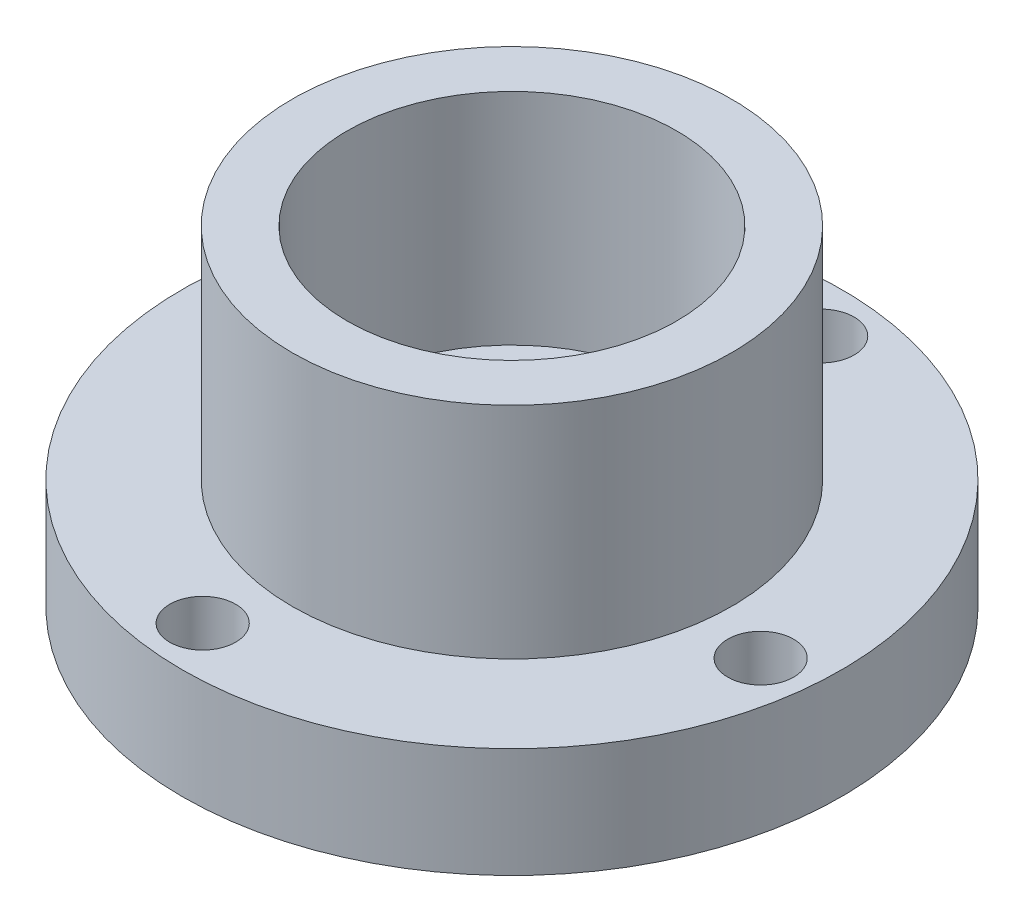
ISO-10303-21;
HEADER;
FILE_DESCRIPTION(('STEP AP214'),'2;1');
FILE_NAME('part.step','',(''),(''),'','','');
FILE_SCHEMA(('AUTOMOTIVE_DESIGN { 1 0 10303 214 1 1 1 1 }'));
ENDSEC;
DATA;
#1=APPLICATION_CONTEXT('core data for automotive mechanical design processes');
#2=APPLICATION_PROTOCOL_DEFINITION('international standard','automotive_design',2000,#1);
#3=PRODUCT_CONTEXT('',#1,'mechanical');
#4=PRODUCT('Part','Part','',(#3));
#5=PRODUCT_RELATED_PRODUCT_CATEGORY('part','',(#4));
#6=PRODUCT_DEFINITION_FORMATION('','',#4);
#7=PRODUCT_DEFINITION_CONTEXT('part definition',#1,'design');
#8=PRODUCT_DEFINITION('design','',#6,#7);
#9=PRODUCT_DEFINITION_SHAPE('','',#8);
#10=(LENGTH_UNIT() NAMED_UNIT(*) SI_UNIT(.MILLI.,.METRE.));
#11=(NAMED_UNIT(*) PLANE_ANGLE_UNIT() SI_UNIT($,.RADIAN.));
#12=(NAMED_UNIT(*) SI_UNIT($,.STERADIAN.) SOLID_ANGLE_UNIT());
#13=UNCERTAINTY_MEASURE_WITH_UNIT(LENGTH_MEASURE(1.E-05),#10,'distance_accuracy_value','');
#14=(GEOMETRIC_REPRESENTATION_CONTEXT(3) GLOBAL_UNCERTAINTY_ASSIGNED_CONTEXT((#13)) GLOBAL_UNIT_ASSIGNED_CONTEXT((#10,
#11,#12)) REPRESENTATION_CONTEXT('',''));
#15=CARTESIAN_POINT('',(0.,0.,0.));
#16=DIRECTION('',(0.,0.,1.));
#17=DIRECTION('',(1.,0.,0.));
#18=AXIS2_PLACEMENT_3D('',#15,#16,#17);
#19=CARTESIAN_POINT('',(0.,5.,0.));
#20=DIRECTION('',(0.,1.,0.));
#21=DIRECTION('',(0.,0.,1.));
#22=AXIS2_PLACEMENT_3D('',#19,#20,#21);
#23=PLANE('',#22);
#24=CARTESIAN_POINT('',(0.,5.,0.));
#25=DIRECTION('',(0.,1.,0.));
#26=DIRECTION('',(0.,0.,1.));
#27=AXIS2_PLACEMENT_3D('',#24,#25,#26);
#28=CIRCLE('',#27,10.);
#29=CARTESIAN_POINT('',(0.,5.,10.));
#30=VERTEX_POINT('',#29);
#31=EDGE_CURVE('E72',#30,#30,#28,.T.);
#32=ORIENTED_EDGE('',*,*,#31,.F.);
#33=EDGE_LOOP('',(#32));
#34=FACE_BOUND('',#33,.T.);
#35=CARTESIAN_POINT('',(12.6976915749806,5.,1.37718271530229));
#36=DIRECTION('',(0.,1.,0.));
#37=DIRECTION('',(0.,0.,1.));
#38=AXIS2_PLACEMENT_3D('',#35,#36,#37);
#39=CIRCLE('',#38,1.5);
#40=CARTESIAN_POINT('',(12.6976915749806,5.,2.87718271530229));
#41=VERTEX_POINT('',#40);
#42=EDGE_CURVE('E57',#41,#41,#39,.T.);
#43=ORIENTED_EDGE('',*,*,#42,.F.);
#44=EDGE_LOOP('',(#43));
#45=FACE_BOUND('',#44,.T.);
#46=CARTESIAN_POINT('',(-12.6976915749806,5.,-1.37718271530229));
#47=DIRECTION('',(0.,1.,0.));
#48=DIRECTION('',(0.,0.,1.));
#49=AXIS2_PLACEMENT_3D('',#46,#47,#48);
#50=CIRCLE('',#49,1.5);
#51=CARTESIAN_POINT('',(-12.6976915749806,5.,0.122817284697706));
#52=VERTEX_POINT('',#51);
#53=EDGE_CURVE('E46',#52,#52,#50,.T.);
#54=ORIENTED_EDGE('',*,*,#53,.F.);
#55=EDGE_LOOP('',(#54));
#56=FACE_BOUND('',#55,.T.);
#57=CARTESIAN_POINT('',(0.,5.,0.));
#58=DIRECTION('',(0.,1.,0.));
#59=DIRECTION('',(0.,0.,1.));
#60=AXIS2_PLACEMENT_3D('',#57,#58,#59);
#61=CIRCLE('',#60,15.);
#62=CARTESIAN_POINT('',(0.,5.,15.));
#63=VERTEX_POINT('',#62);
#64=EDGE_CURVE('E37',#63,#63,#61,.T.);
#65=ORIENTED_EDGE('',*,*,#64,.T.);
#66=EDGE_LOOP('',(#65));
#67=FACE_BOUND('',#66,.T.);
#68=CARTESIAN_POINT('',(1.37718271530229,5.,-12.6976915749806));
#69=DIRECTION('',(0.,1.,0.));
#70=DIRECTION('',(0.,0.,1.));
#71=AXIS2_PLACEMENT_3D('',#68,#69,#70);
#72=CIRCLE('',#71,1.5);
#73=CARTESIAN_POINT('',(1.37718271530229,5.,-11.1976915749806));
#74=VERTEX_POINT('',#73);
#75=EDGE_CURVE('E51',#74,#74,#72,.T.);
#76=ORIENTED_EDGE('',*,*,#75,.F.);
#77=EDGE_LOOP('',(#76));
#78=FACE_BOUND('',#77,.T.);
#79=CARTESIAN_POINT('',(-1.37718271530229,5.,12.6976915749806));
#80=DIRECTION('',(0.,1.,0.));
#81=DIRECTION('',(0.,0.,1.));
#82=AXIS2_PLACEMENT_3D('',#79,#80,#81);
#83=CIRCLE('',#82,1.5);
#84=CARTESIAN_POINT('',(-1.37718271530229,5.,14.1976915749806));
#85=VERTEX_POINT('',#84);
#86=EDGE_CURVE('E63',#85,#85,#83,.T.);
#87=ORIENTED_EDGE('',*,*,#86,.F.);
#88=EDGE_LOOP('',(#87));
#89=FACE_BOUND('',#88,.T.);
#90=ADVANCED_FACE('F30',(#34,#45,#56,#67,#78,#89),#23,.T.);
#91=CARTESIAN_POINT('',(0.,0.,0.));
#92=DIRECTION('',(0.,1.,0.));
#93=DIRECTION('',(0.,0.,1.));
#94=AXIS2_PLACEMENT_3D('',#91,#92,#93);
#95=PLANE('',#94);
#96=CARTESIAN_POINT('',(0.,0.,0.));
#97=DIRECTION('',(0.,1.,0.));
#98=DIRECTION('',(0.,0.,1.));
#99=AXIS2_PLACEMENT_3D('',#96,#97,#98);
#100=CIRCLE('',#99,15.);
#101=CARTESIAN_POINT('',(0.,0.,15.));
#102=VERTEX_POINT('',#101);
#103=EDGE_CURVE('E41',#102,#102,#100,.T.);
#104=ORIENTED_EDGE('',*,*,#103,.F.);
#105=EDGE_LOOP('',(#104));
#106=FACE_BOUND('',#105,.T.);
#107=CARTESIAN_POINT('',(-12.6976915749806,0.,-1.37718271530229));
#108=DIRECTION('',(0.,1.,0.));
#109=DIRECTION('',(0.,0.,1.));
#110=AXIS2_PLACEMENT_3D('',#107,#108,#109);
#111=CIRCLE('',#110,1.5);
#112=CARTESIAN_POINT('',(-12.6976915749806,0.,0.122817284697706));
#113=VERTEX_POINT('',#112);
#114=EDGE_CURVE('E48',#113,#113,#111,.T.);
#115=ORIENTED_EDGE('',*,*,#114,.T.);
#116=EDGE_LOOP('',(#115));
#117=FACE_BOUND('',#116,.T.);
#118=CARTESIAN_POINT('',(1.37718271530229,0.,-12.6976915749806));
#119=DIRECTION('',(0.,1.,0.));
#120=DIRECTION('',(0.,0.,1.));
#121=AXIS2_PLACEMENT_3D('',#118,#119,#120);
#122=CIRCLE('',#121,1.5);
#123=CARTESIAN_POINT('',(1.37718271530229,0.,-11.1976915749806));
#124=VERTEX_POINT('',#123);
#125=EDGE_CURVE('E54',#124,#124,#122,.T.);
#126=ORIENTED_EDGE('',*,*,#125,.T.);
#127=EDGE_LOOP('',(#126));
#128=FACE_BOUND('',#127,.T.);
#129=CARTESIAN_POINT('',(12.6976915749806,0.,1.37718271530229));
#130=DIRECTION('',(0.,1.,0.));
#131=DIRECTION('',(0.,0.,1.));
#132=AXIS2_PLACEMENT_3D('',#129,#130,#131);
#133=CIRCLE('',#132,1.5);
#134=CARTESIAN_POINT('',(12.6976915749806,0.,2.87718271530229));
#135=VERTEX_POINT('',#134);
#136=EDGE_CURVE('E60',#135,#135,#133,.T.);
#137=ORIENTED_EDGE('',*,*,#136,.T.);
#138=EDGE_LOOP('',(#137));
#139=FACE_BOUND('',#138,.T.);
#140=CARTESIAN_POINT('',(-1.37718271530229,0.,12.6976915749806));
#141=DIRECTION('',(0.,1.,0.));
#142=DIRECTION('',(0.,0.,1.));
#143=AXIS2_PLACEMENT_3D('',#140,#141,#142);
#144=CIRCLE('',#143,1.5);
#145=CARTESIAN_POINT('',(-1.37718271530229,0.,14.1976915749806));
#146=VERTEX_POINT('',#145);
#147=EDGE_CURVE('E66',#146,#146,#144,.T.);
#148=ORIENTED_EDGE('',*,*,#147,.T.);
#149=EDGE_LOOP('',(#148));
#150=FACE_BOUND('',#149,.T.);
#151=ADVANCED_FACE('F100',(#106,#117,#128,#139,#150),#95,.F.);
#152=CARTESIAN_POINT('',(0.,5.,0.));
#153=DIRECTION('',(0.,-1.,0.));
#154=DIRECTION('',(0.,0.,-1.));
#155=AXIS2_PLACEMENT_3D('',#152,#153,#154);
#156=CYLINDRICAL_SURFACE('',#155,15.);
#157=ORIENTED_EDGE('',*,*,#64,.F.);
#158=EDGE_LOOP('',(#157));
#159=FACE_BOUND('',#158,.T.);
#160=ORIENTED_EDGE('',*,*,#103,.T.);
#161=EDGE_LOOP('',(#160));
#162=FACE_BOUND('',#161,.T.);
#163=ADVANCED_FACE('F32',(#159,#162),#156,.T.);
#164=CARTESIAN_POINT('',(-12.6976915749806,5.,-1.37718271530229));
#165=DIRECTION('',(0.,-1.,0.));
#166=DIRECTION('',(0.,0.,-1.));
#167=AXIS2_PLACEMENT_3D('',#164,#165,#166);
#168=CYLINDRICAL_SURFACE('',#167,1.5);
#169=ORIENTED_EDGE('',*,*,#53,.T.);
#170=EDGE_LOOP('',(#169));
#171=FACE_BOUND('',#170,.T.);
#172=ORIENTED_EDGE('',*,*,#114,.F.);
#173=EDGE_LOOP('',(#172));
#174=FACE_BOUND('',#173,.T.);
#175=ADVANCED_FACE('F157',(#171,#174),#168,.F.);
#176=CARTESIAN_POINT('',(1.37718271530229,5.,-12.6976915749806));
#177=DIRECTION('',(0.,-1.,0.));
#178=DIRECTION('',(0.,0.,-1.));
#179=AXIS2_PLACEMENT_3D('',#176,#177,#178);
#180=CYLINDRICAL_SURFACE('',#179,1.5);
#181=ORIENTED_EDGE('',*,*,#75,.T.);
#182=EDGE_LOOP('',(#181));
#183=FACE_BOUND('',#182,.T.);
#184=ORIENTED_EDGE('',*,*,#125,.F.);
#185=EDGE_LOOP('',(#184));
#186=FACE_BOUND('',#185,.T.);
#187=ADVANCED_FACE('F147',(#183,#186),#180,.F.);
#188=CARTESIAN_POINT('',(12.6976915749806,5.,1.37718271530229));
#189=DIRECTION('',(0.,-1.,0.));
#190=DIRECTION('',(0.,0.,-1.));
#191=AXIS2_PLACEMENT_3D('',#188,#189,#190);
#192=CYLINDRICAL_SURFACE('',#191,1.5);
#193=ORIENTED_EDGE('',*,*,#42,.T.);
#194=EDGE_LOOP('',(#193));
#195=FACE_BOUND('',#194,.T.);
#196=ORIENTED_EDGE('',*,*,#136,.F.);
#197=EDGE_LOOP('',(#196));
#198=FACE_BOUND('',#197,.T.);
#199=ADVANCED_FACE('F95',(#195,#198),#192,.F.);
#200=CARTESIAN_POINT('',(-1.37718271530229,5.,12.6976915749806));
#201=DIRECTION('',(0.,-1.,0.));
#202=DIRECTION('',(0.,0.,-1.));
#203=AXIS2_PLACEMENT_3D('',#200,#201,#202);
#204=CYLINDRICAL_SURFACE('',#203,1.5);
#205=ORIENTED_EDGE('',*,*,#86,.T.);
#206=EDGE_LOOP('',(#205));
#207=FACE_BOUND('',#206,.T.);
#208=ORIENTED_EDGE('',*,*,#147,.F.);
#209=EDGE_LOOP('',(#208));
#210=FACE_BOUND('',#209,.T.);
#211=ADVANCED_FACE('F86',(#207,#210),#204,.F.);
#212=CARTESIAN_POINT('',(0.,15.,0.));
#213=DIRECTION('',(0.,1.,0.));
#214=DIRECTION('',(0.,0.,1.));
#215=AXIS2_PLACEMENT_3D('',#212,#213,#214);
#216=PLANE('',#215);
#217=CARTESIAN_POINT('',(0.,15.,0.));
#218=DIRECTION('',(0.,1.,0.));
#219=DIRECTION('',(0.,0.,1.));
#220=AXIS2_PLACEMENT_3D('',#217,#218,#219);
#221=CIRCLE('',#220,10.);
#222=CARTESIAN_POINT('',(0.,15.,10.));
#223=VERTEX_POINT('',#222);
#224=EDGE_CURVE('E69',#223,#223,#221,.T.);
#225=ORIENTED_EDGE('',*,*,#224,.T.);
#226=EDGE_LOOP('',(#225));
#227=FACE_BOUND('',#226,.T.);
#228=CARTESIAN_POINT('',(0.,15.,0.));
#229=DIRECTION('',(0.,1.,0.));
#230=DIRECTION('',(0.,0.,1.));
#231=AXIS2_PLACEMENT_3D('',#228,#229,#230);
#232=CIRCLE('',#231,7.5);
#233=CARTESIAN_POINT('',(0.,15.,7.5));
#234=VERTEX_POINT('',#233);
#235=EDGE_CURVE('E75',#234,#234,#232,.T.);
#236=ORIENTED_EDGE('',*,*,#235,.F.);
#237=EDGE_LOOP('',(#236));
#238=FACE_BOUND('',#237,.T.);
#239=ADVANCED_FACE('F83',(#227,#238),#216,.T.);
#240=CARTESIAN_POINT('',(0.,15.,0.));
#241=DIRECTION('',(0.,-1.,0.));
#242=DIRECTION('',(0.,0.,-1.));
#243=AXIS2_PLACEMENT_3D('',#240,#241,#242);
#244=CYLINDRICAL_SURFACE('',#243,10.);
#245=ORIENTED_EDGE('',*,*,#224,.F.);
#246=EDGE_LOOP('',(#245));
#247=FACE_BOUND('',#246,.T.);
#248=ORIENTED_EDGE('',*,*,#31,.T.);
#249=EDGE_LOOP('',(#248));
#250=FACE_BOUND('',#249,.T.);
#251=ADVANCED_FACE('F85',(#247,#250),#244,.T.);
#252=CARTESIAN_POINT('',(0.,15.,0.));
#253=DIRECTION('',(0.,-1.,0.));
#254=DIRECTION('',(0.,0.,-1.));
#255=AXIS2_PLACEMENT_3D('',#252,#253,#254);
#256=CYLINDRICAL_SURFACE('',#255,7.5);
#257=ORIENTED_EDGE('',*,*,#235,.T.);
#258=EDGE_LOOP('',(#257));
#259=FACE_BOUND('',#258,.T.);
#260=CARTESIAN_POINT('',(0.,5.,0.));
#261=DIRECTION('',(0.,1.,0.));
#262=DIRECTION('',(0.,0.,1.));
#263=AXIS2_PLACEMENT_3D('',#260,#261,#262);
#264=CIRCLE('',#263,7.5);
#265=CARTESIAN_POINT('',(0.,5.,7.5));
#266=VERTEX_POINT('',#265);
#267=EDGE_CURVE('E10',#266,#266,#264,.F.);
#268=ORIENTED_EDGE('',*,*,#267,.T.);
#269=EDGE_LOOP('',(#268));
#270=FACE_BOUND('',#269,.T.);
#271=ADVANCED_FACE('F81',(#259,#270),#256,.F.);
#272=ORIENTED_EDGE('',*,*,#267,.F.);
#273=EDGE_LOOP('',(#272));
#274=FACE_BOUND('',#273,.T.);
#275=ADVANCED_FACE('F103',(#274),#23,.T.);
#276=CLOSED_SHELL('',(#90,#151,#163,#175,#187,#199,#211,#239,#251,#271,#275));
#277=MANIFOLD_SOLID_BREP('B2',#276);
#278=ADVANCED_BREP_SHAPE_REPRESENTATION('',(#18,#277),#14);
#279=SHAPE_DEFINITION_REPRESENTATION(#9,#278);
ENDSEC;
END-ISO-10303-21;
